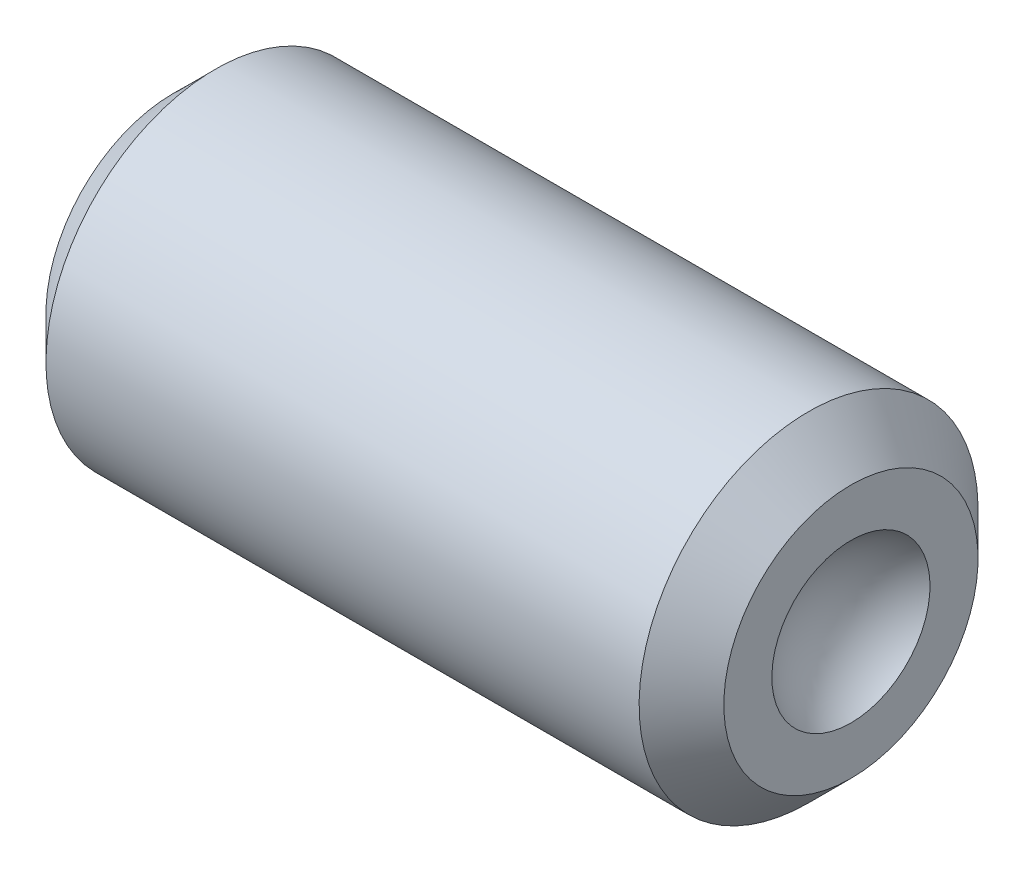
ISO-10303-21;
HEADER;
FILE_DESCRIPTION(('STEP AP214'),'2;1');
FILE_NAME('part.step','',(''),(''),'','','');
FILE_SCHEMA(('AUTOMOTIVE_DESIGN { 1 0 10303 214 1 1 1 1 }'));
ENDSEC;
DATA;
#1=APPLICATION_CONTEXT('core data for automotive mechanical design processes');
#2=APPLICATION_PROTOCOL_DEFINITION('international standard','automotive_design',2000,#1);
#3=PRODUCT_CONTEXT('',#1,'mechanical');
#4=PRODUCT('Part','Part','',(#3));
#5=PRODUCT_RELATED_PRODUCT_CATEGORY('part','',(#4));
#6=PRODUCT_DEFINITION_FORMATION('','',#4);
#7=PRODUCT_DEFINITION_CONTEXT('part definition',#1,'design');
#8=PRODUCT_DEFINITION('design','',#6,#7);
#9=PRODUCT_DEFINITION_SHAPE('','',#8);
#10=(LENGTH_UNIT() NAMED_UNIT(*) SI_UNIT(.MILLI.,.METRE.));
#11=(NAMED_UNIT(*) PLANE_ANGLE_UNIT() SI_UNIT($,.RADIAN.));
#12=(NAMED_UNIT(*) SI_UNIT($,.STERADIAN.) SOLID_ANGLE_UNIT());
#13=UNCERTAINTY_MEASURE_WITH_UNIT(LENGTH_MEASURE(1.E-05),#10,'distance_accuracy_value','');
#14=(GEOMETRIC_REPRESENTATION_CONTEXT(3) GLOBAL_UNCERTAINTY_ASSIGNED_CONTEXT((#13)) GLOBAL_UNIT_ASSIGNED_CONTEXT((#10,
#11,#12)) REPRESENTATION_CONTEXT('',''));
#15=CARTESIAN_POINT('',(0.,0.,0.));
#16=DIRECTION('',(0.,0.,1.));
#17=DIRECTION('',(1.,0.,0.));
#18=AXIS2_PLACEMENT_3D('',#15,#16,#17);
#19=CARTESIAN_POINT('',(0.,0.,0.));
#20=DIRECTION('',(1.,0.,0.));
#21=DIRECTION('',(0.,1.,0.));
#22=AXIS2_PLACEMENT_3D('',#19,#20,#21);
#23=PLANE('',#22);
#24=DIRECTION('',(0.,-0.5,-0.866025403784439));
#25=VECTOR('',#24,1.);
#26=CARTESIAN_POINT('',(0.,0.866025403784439,0.));
#27=LINE('',#26,#25);
#28=CARTESIAN_POINT('',(0.,0.866025403784439,0.));
#29=VERTEX_POINT('',#28);
#30=CARTESIAN_POINT('',(0.,0.43301270189222,-0.75));
#31=VERTEX_POINT('',#30);
#32=EDGE_CURVE('E107',#29,#31,#27,.T.);
#33=ORIENTED_EDGE('',*,*,#32,.F.);
#34=DIRECTION('',(0.,0.5,-0.866025403784439));
#35=VECTOR('',#34,1.);
#36=CARTESIAN_POINT('',(0.,0.433012701892219,0.75));
#37=LINE('',#36,#35);
#38=CARTESIAN_POINT('',(0.,0.433012701892219,0.75));
#39=VERTEX_POINT('',#38);
#40=EDGE_CURVE('E49',#39,#29,#37,.T.);
#41=ORIENTED_EDGE('',*,*,#40,.F.);
#42=DIRECTION('',(0.,1.,0.));
#43=VECTOR('',#42,1.);
#44=CARTESIAN_POINT('',(0.,-0.43301270189222,0.75));
#45=LINE('',#44,#43);
#46=CARTESIAN_POINT('',(0.,-0.43301270189222,0.75));
#47=VERTEX_POINT('',#46);
#48=EDGE_CURVE('E122',#47,#39,#45,.T.);
#49=ORIENTED_EDGE('',*,*,#48,.F.);
#50=DIRECTION('',(0.,0.5,0.866025403784439));
#51=VECTOR('',#50,1.);
#52=CARTESIAN_POINT('',(0.,-0.866025403784439,0.));
#53=LINE('',#52,#51);
#54=CARTESIAN_POINT('',(0.,-0.866025403784439,0.));
#55=VERTEX_POINT('',#54);
#56=EDGE_CURVE('E116',#55,#47,#53,.T.);
#57=ORIENTED_EDGE('',*,*,#56,.F.);
#58=DIRECTION('',(0.,-0.5,0.866025403784439));
#59=VECTOR('',#58,1.);
#60=CARTESIAN_POINT('',(0.,-0.433012701892219,-0.75));
#61=LINE('',#60,#59);
#62=CARTESIAN_POINT('',(0.,-0.433012701892219,-0.75));
#63=VERTEX_POINT('',#62);
#64=EDGE_CURVE('E114',#63,#55,#61,.T.);
#65=ORIENTED_EDGE('',*,*,#64,.F.);
#66=DIRECTION('',(0.,-1.,0.));
#67=VECTOR('',#66,1.);
#68=CARTESIAN_POINT('',(0.,0.43301270189222,-0.75));
#69=LINE('',#68,#67);
#70=EDGE_CURVE('E100',#31,#63,#69,.T.);
#71=ORIENTED_EDGE('',*,*,#70,.F.);
#72=EDGE_LOOP('',(#33,#41,#49,#57,#65,#71));
#73=FACE_BOUND('',#72,.T.);
#74=CARTESIAN_POINT('',(0.,0.,0.));
#75=DIRECTION('',(-1.,0.,0.));
#76=DIRECTION('',(0.,-1.,0.));
#77=AXIS2_PLACEMENT_3D('',#74,#75,#76);
#78=CIRCLE('',#77,1.125);
#79=CARTESIAN_POINT('',(0.,-1.125,0.));
#80=VERTEX_POINT('',#79);
#81=EDGE_CURVE('E12',#80,#80,#78,.T.);
#82=ORIENTED_EDGE('',*,*,#81,.T.);
#83=EDGE_LOOP('',(#82));
#84=FACE_BOUND('',#83,.T.);
#85=ADVANCED_FACE('F35',(#73,#84),#23,.F.);
#86=CARTESIAN_POINT('',(0.375000000000001,0.,0.));
#87=DIRECTION('',(1.,0.,0.));
#88=DIRECTION('',(0.,1.,0.));
#89=AXIS2_PLACEMENT_3D('',#86,#87,#88);
#90=CONICAL_SURFACE('',#89,1.5,0.785398163397447);
#91=ORIENTED_EDGE('',*,*,#81,.F.);
#92=EDGE_LOOP('',(#91));
#93=FACE_BOUND('',#92,.T.);
#94=CARTESIAN_POINT('',(0.375000000000001,0.,0.));
#95=DIRECTION('',(-1.,0.,0.));
#96=DIRECTION('',(0.,-1.,0.));
#97=AXIS2_PLACEMENT_3D('',#94,#95,#96);
#98=CIRCLE('',#97,1.5);
#99=CARTESIAN_POINT('',(0.375000000000001,-1.5,0.));
#100=VERTEX_POINT('',#99);
#101=EDGE_CURVE('E42',#100,#100,#98,.T.);
#102=ORIENTED_EDGE('',*,*,#101,.T.);
#103=EDGE_LOOP('',(#102));
#104=FACE_BOUND('',#103,.T.);
#105=ADVANCED_FACE('F145',(#93,#104),#90,.T.);
#106=CARTESIAN_POINT('',(0.,0.,0.));
#107=DIRECTION('',(-1.,0.,0.));
#108=DIRECTION('',(0.,-1.,0.));
#109=AXIS2_PLACEMENT_3D('',#106,#107,#108);
#110=CYLINDRICAL_SURFACE('',#109,1.5);
#111=ORIENTED_EDGE('',*,*,#101,.F.);
#112=EDGE_LOOP('',(#111));
#113=FACE_BOUND('',#112,.T.);
#114=CARTESIAN_POINT('',(5.625,0.,0.));
#115=DIRECTION('',(-1.,0.,0.));
#116=DIRECTION('',(0.,-1.,0.));
#117=AXIS2_PLACEMENT_3D('',#114,#115,#116);
#118=CIRCLE('',#117,1.5);
#119=CARTESIAN_POINT('',(5.625,-1.5,0.));
#120=VERTEX_POINT('',#119);
#121=EDGE_CURVE('E140',#120,#120,#118,.T.);
#122=ORIENTED_EDGE('',*,*,#121,.T.);
#123=EDGE_LOOP('',(#122));
#124=FACE_BOUND('',#123,.T.);
#125=ADVANCED_FACE('F147',(#113,#124),#110,.T.);
#126=CARTESIAN_POINT('',(6.,0.,0.));
#127=DIRECTION('',(-1.,0.,0.));
#128=DIRECTION('',(0.,-1.,0.));
#129=AXIS2_PLACEMENT_3D('',#126,#127,#128);
#130=CONICAL_SURFACE('',#129,1.125,0.785398163397451);
#131=ORIENTED_EDGE('',*,*,#121,.F.);
#132=EDGE_LOOP('',(#131));
#133=FACE_BOUND('',#132,.T.);
#134=CARTESIAN_POINT('',(6.,0.,0.));
#135=DIRECTION('',(-1.,0.,0.));
#136=DIRECTION('',(0.,-1.,0.));
#137=AXIS2_PLACEMENT_3D('',#134,#135,#136);
#138=CIRCLE('',#137,1.125);
#139=CARTESIAN_POINT('',(6.,-1.125,0.));
#140=VERTEX_POINT('',#139);
#141=EDGE_CURVE('E137',#140,#140,#138,.T.);
#142=ORIENTED_EDGE('',*,*,#141,.T.);
#143=EDGE_LOOP('',(#142));
#144=FACE_BOUND('',#143,.T.);
#145=ADVANCED_FACE('F150',(#133,#144),#130,.T.);
#146=CARTESIAN_POINT('',(6.,1.125,0.));
#147=DIRECTION('',(-1.,0.,0.));
#148=DIRECTION('',(0.,-1.,0.));
#149=AXIS2_PLACEMENT_3D('',#146,#147,#148);
#150=PLANE('',#149);
#151=ORIENTED_EDGE('',*,*,#141,.F.);
#152=EDGE_LOOP('',(#151));
#153=FACE_BOUND('',#152,.T.);
#154=CARTESIAN_POINT('',(6.,0.,0.));
#155=DIRECTION('',(-1.,0.,0.));
#156=DIRECTION('',(0.,-1.,0.));
#157=AXIS2_PLACEMENT_3D('',#154,#155,#156);
#158=CIRCLE('',#157,0.7);
#159=CARTESIAN_POINT('',(6.,-0.7,0.));
#160=VERTEX_POINT('',#159);
#161=EDGE_CURVE('E134',#160,#160,#158,.T.);
#162=ORIENTED_EDGE('',*,*,#161,.T.);
#163=EDGE_LOOP('',(#162));
#164=FACE_BOUND('',#163,.T.);
#165=ADVANCED_FACE('F156',(#153,#164),#150,.F.);
#166=CARTESIAN_POINT('',(6.46583333333334,0.,0.));
#167=DIRECTION('',(-1.,0.,0.));
#168=DIRECTION('',(0.,-1.,0.));
#169=AXIS2_PLACEMENT_3D('',#166,#167,#168);
#170=SPHERICAL_SURFACE('',#169,0.840833333333334);
#171=ORIENTED_EDGE('',*,*,#161,.F.);
#172=EDGE_LOOP('',(#171));
#173=FACE_BOUND('',#172,.T.);
#174=ADVANCED_FACE('F162',(#173),#170,.F.);
#175=CARTESIAN_POINT('',(8.29128784747792,0.433012701892219,0.75));
#176=DIRECTION('',(0.,0.866025403784438,0.5));
#177=DIRECTION('',(0.,-0.5,0.866025403784439));
#178=AXIS2_PLACEMENT_3D('',#175,#176,#177);
#179=PLANE('',#178);
#180=DIRECTION('',(0.,-0.5,0.866025403784439));
#181=VECTOR('',#180,1.);
#182=CARTESIAN_POINT('',(4.,0.433012701892219,0.75));
#183=LINE('',#182,#181);
#184=CARTESIAN_POINT('',(4.,0.866025403784439,0.));
#185=VERTEX_POINT('',#184);
#186=CARTESIAN_POINT('',(4.,0.433012701892219,0.75));
#187=VERTEX_POINT('',#186);
#188=EDGE_CURVE('E68',#185,#187,#183,.T.);
#189=ORIENTED_EDGE('',*,*,#188,.T.);
#190=DIRECTION('',(-1.,0.,0.));
#191=VECTOR('',#190,1.);
#192=CARTESIAN_POINT('',(8.29128784747792,0.433012701892219,0.75));
#193=LINE('',#192,#191);
#194=EDGE_CURVE('E125',#187,#39,#193,.T.);
#195=ORIENTED_EDGE('',*,*,#194,.T.);
#196=ORIENTED_EDGE('',*,*,#40,.T.);
#197=DIRECTION('',(-1.,0.,0.));
#198=VECTOR('',#197,1.);
#199=CARTESIAN_POINT('',(8.29128784747792,0.866025403784439,0.));
#200=LINE('',#199,#198);
#201=EDGE_CURVE('E104',#185,#29,#200,.T.);
#202=ORIENTED_EDGE('',*,*,#201,.F.);
#203=EDGE_LOOP('',(#189,#195,#196,#202));
#204=FACE_BOUND('',#203,.T.);
#205=ADVANCED_FACE('F167',(#204),#179,.F.);
#206=CARTESIAN_POINT('',(8.29128784747792,-0.43301270189222,0.75));
#207=DIRECTION('',(0.,0.,1.));
#208=DIRECTION('',(0.,-1.,0.));
#209=AXIS2_PLACEMENT_3D('',#206,#207,#208);
#210=PLANE('',#209);
#211=DIRECTION('',(0.,-1.,0.));
#212=VECTOR('',#211,1.);
#213=CARTESIAN_POINT('',(4.,-0.43301270189222,0.75));
#214=LINE('',#213,#212);
#215=CARTESIAN_POINT('',(4.,-0.43301270189222,0.75));
#216=VERTEX_POINT('',#215);
#217=EDGE_CURVE('E267',#187,#216,#214,.T.);
#218=ORIENTED_EDGE('',*,*,#217,.T.);
#219=DIRECTION('',(-1.,0.,0.));
#220=VECTOR('',#219,1.);
#221=CARTESIAN_POINT('',(8.29128784747792,-0.43301270189222,0.75));
#222=LINE('',#221,#220);
#223=EDGE_CURVE('E127',#216,#47,#222,.T.);
#224=ORIENTED_EDGE('',*,*,#223,.T.);
#225=ORIENTED_EDGE('',*,*,#48,.T.);
#226=ORIENTED_EDGE('',*,*,#194,.F.);
#227=EDGE_LOOP('',(#218,#224,#225,#226));
#228=FACE_BOUND('',#227,.T.);
#229=ADVANCED_FACE('F172',(#228),#210,.F.);
#230=CARTESIAN_POINT('',(8.29128784747792,-0.866025403784439,0.));
#231=DIRECTION('',(0.,-0.866025403784439,0.5));
#232=DIRECTION('',(0.,-0.5,-0.866025403784439));
#233=AXIS2_PLACEMENT_3D('',#230,#231,#232);
#234=PLANE('',#233);
#235=DIRECTION('',(0.,-0.5,-0.866025403784439));
#236=VECTOR('',#235,1.);
#237=CARTESIAN_POINT('',(4.,-0.866025403784439,0.));
#238=LINE('',#237,#236);
#239=CARTESIAN_POINT('',(4.,-0.866025403784439,0.));
#240=VERTEX_POINT('',#239);
#241=EDGE_CURVE('E270',#216,#240,#238,.T.);
#242=ORIENTED_EDGE('',*,*,#241,.T.);
#243=DIRECTION('',(-1.,0.,0.));
#244=VECTOR('',#243,1.);
#245=CARTESIAN_POINT('',(8.29128784747792,-0.866025403784439,0.));
#246=LINE('',#245,#244);
#247=EDGE_CURVE('E129',#240,#55,#246,.T.);
#248=ORIENTED_EDGE('',*,*,#247,.T.);
#249=ORIENTED_EDGE('',*,*,#56,.T.);
#250=ORIENTED_EDGE('',*,*,#223,.F.);
#251=EDGE_LOOP('',(#242,#248,#249,#250));
#252=FACE_BOUND('',#251,.T.);
#253=ADVANCED_FACE('F217',(#252),#234,.F.);
#254=CARTESIAN_POINT('',(8.29128784747792,-0.433012701892219,-0.75));
#255=DIRECTION('',(0.,-0.866025403784439,-0.5));
#256=DIRECTION('',(0.,0.5,-0.866025403784439));
#257=AXIS2_PLACEMENT_3D('',#254,#255,#256);
#258=PLANE('',#257);
#259=DIRECTION('',(0.,0.5,-0.866025403784439));
#260=VECTOR('',#259,1.);
#261=CARTESIAN_POINT('',(4.,-0.433012701892219,-0.75));
#262=LINE('',#261,#260);
#263=CARTESIAN_POINT('',(4.,-0.433012701892219,-0.75));
#264=VERTEX_POINT('',#263);
#265=EDGE_CURVE('E58',#240,#264,#262,.T.);
#266=ORIENTED_EDGE('',*,*,#265,.T.);
#267=DIRECTION('',(-1.,0.,0.));
#268=VECTOR('',#267,1.);
#269=CARTESIAN_POINT('',(8.29128784747792,-0.433012701892219,-0.75));
#270=LINE('',#269,#268);
#271=EDGE_CURVE('E103',#264,#63,#270,.T.);
#272=ORIENTED_EDGE('',*,*,#271,.T.);
#273=ORIENTED_EDGE('',*,*,#64,.T.);
#274=ORIENTED_EDGE('',*,*,#247,.F.);
#275=EDGE_LOOP('',(#266,#272,#273,#274));
#276=FACE_BOUND('',#275,.T.);
#277=ADVANCED_FACE('F227',(#276),#258,.F.);
#278=CARTESIAN_POINT('',(8.29128784747792,0.43301270189222,-0.75));
#279=DIRECTION('',(0.,0.,-1.));
#280=DIRECTION('',(-1.,0.,0.));
#281=AXIS2_PLACEMENT_3D('',#278,#279,#280);
#282=PLANE('',#281);
#283=DIRECTION('',(0.,1.,0.));
#284=VECTOR('',#283,1.);
#285=CARTESIAN_POINT('',(4.,0.43301270189222,-0.75));
#286=LINE('',#285,#284);
#287=CARTESIAN_POINT('',(4.,0.43301270189222,-0.75));
#288=VERTEX_POINT('',#287);
#289=EDGE_CURVE('E102',#264,#288,#286,.T.);
#290=ORIENTED_EDGE('',*,*,#289,.T.);
#291=DIRECTION('',(-1.,0.,0.));
#292=VECTOR('',#291,1.);
#293=CARTESIAN_POINT('',(8.29128784747792,0.43301270189222,-0.75));
#294=LINE('',#293,#292);
#295=EDGE_CURVE('E95',#288,#31,#294,.T.);
#296=ORIENTED_EDGE('',*,*,#295,.T.);
#297=ORIENTED_EDGE('',*,*,#70,.T.);
#298=ORIENTED_EDGE('',*,*,#271,.F.);
#299=EDGE_LOOP('',(#290,#296,#297,#298));
#300=FACE_BOUND('',#299,.T.);
#301=ADVANCED_FACE('F97',(#300),#282,.F.);
#302=CARTESIAN_POINT('',(8.29128784747792,0.866025403784439,0.));
#303=DIRECTION('',(0.,0.866025403784439,-0.5));
#304=DIRECTION('',(0.,0.5,0.866025403784439));
#305=AXIS2_PLACEMENT_3D('',#302,#303,#304);
#306=PLANE('',#305);
#307=DIRECTION('',(0.,0.5,0.866025403784439));
#308=VECTOR('',#307,1.);
#309=CARTESIAN_POINT('',(4.,0.866025403784439,0.));
#310=LINE('',#309,#308);
#311=EDGE_CURVE('E77',#288,#185,#310,.T.);
#312=ORIENTED_EDGE('',*,*,#311,.T.);
#313=ORIENTED_EDGE('',*,*,#201,.T.);
#314=ORIENTED_EDGE('',*,*,#32,.T.);
#315=ORIENTED_EDGE('',*,*,#295,.F.);
#316=EDGE_LOOP('',(#312,#313,#314,#315));
#317=FACE_BOUND('',#316,.T.);
#318=ADVANCED_FACE('F108',(#317),#306,.F.);
#319=CARTESIAN_POINT('',(4.,1.125,0.));
#320=DIRECTION('',(-1.,0.,0.));
#321=DIRECTION('',(0.,-1.,0.));
#322=AXIS2_PLACEMENT_3D('',#319,#320,#321);
#323=PLANE('',#322);
#324=ORIENTED_EDGE('',*,*,#188,.F.);
#325=ORIENTED_EDGE('',*,*,#311,.F.);
#326=ORIENTED_EDGE('',*,*,#289,.F.);
#327=ORIENTED_EDGE('',*,*,#265,.F.);
#328=ORIENTED_EDGE('',*,*,#241,.F.);
#329=ORIENTED_EDGE('',*,*,#217,.F.);
#330=EDGE_LOOP('',(#324,#325,#326,#327,#328,#329));
#331=FACE_BOUND('',#330,.T.);
#332=ADVANCED_FACE('F253',(#331),#323,.T.);
#333=CLOSED_SHELL('',(#85,#105,#125,#145,#165,#174,#205,#229,#253,#277,#301,#318,#332));
#334=MANIFOLD_SOLID_BREP('B2',#333);
#335=ADVANCED_BREP_SHAPE_REPRESENTATION('',(#18,#334),#14);
#336=SHAPE_DEFINITION_REPRESENTATION(#9,#335);
ENDSEC;
END-ISO-10303-21;
